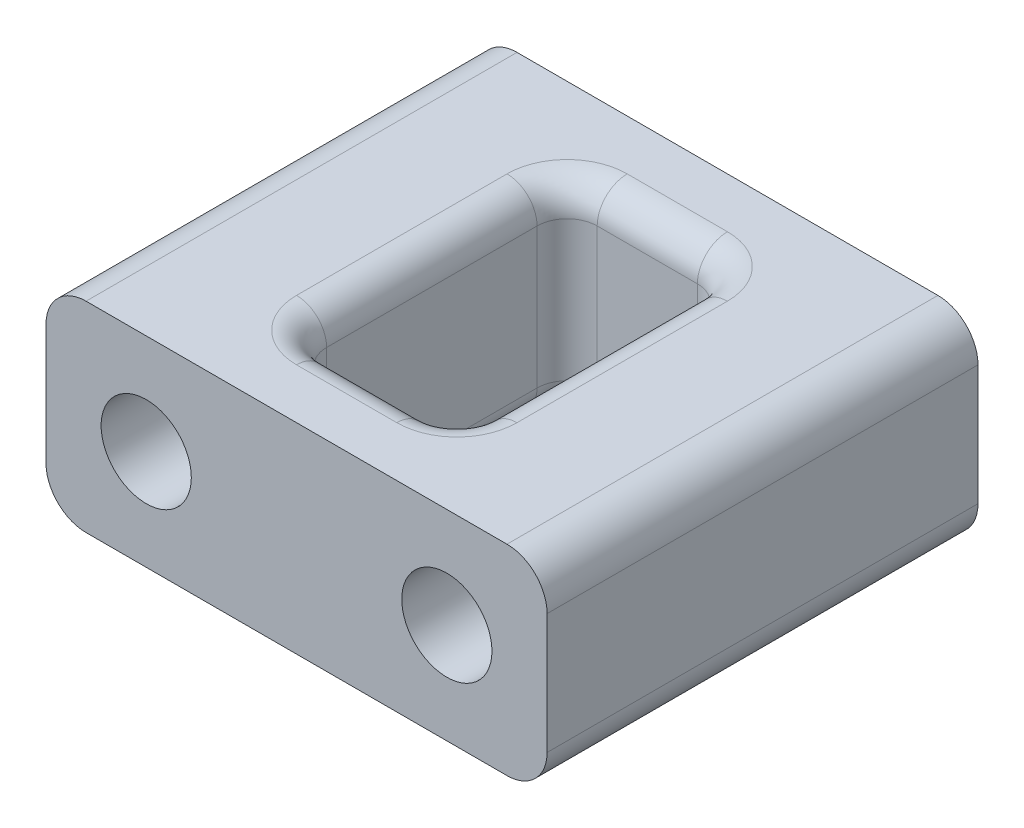
ISO-10303-21;
HEADER;
FILE_DESCRIPTION(('STEP AP214'),'2;1');
FILE_NAME('part.step','',(''),(''),'','','');
FILE_SCHEMA(('AUTOMOTIVE_DESIGN { 1 0 10303 214 1 1 1 1 }'));
ENDSEC;
DATA;
#1=APPLICATION_CONTEXT('core data for automotive mechanical design processes');
#2=APPLICATION_PROTOCOL_DEFINITION('international standard','automotive_design',2000,#1);
#3=PRODUCT_CONTEXT('',#1,'mechanical');
#4=PRODUCT('Part','Part','',(#3));
#5=PRODUCT_RELATED_PRODUCT_CATEGORY('part','',(#4));
#6=PRODUCT_DEFINITION_FORMATION('','',#4);
#7=PRODUCT_DEFINITION_CONTEXT('part definition',#1,'design');
#8=PRODUCT_DEFINITION('design','',#6,#7);
#9=PRODUCT_DEFINITION_SHAPE('','',#8);
#10=(LENGTH_UNIT() NAMED_UNIT(*) SI_UNIT(.MILLI.,.METRE.));
#11=(NAMED_UNIT(*) PLANE_ANGLE_UNIT() SI_UNIT($,.RADIAN.));
#12=(NAMED_UNIT(*) SI_UNIT($,.STERADIAN.) SOLID_ANGLE_UNIT());
#13=UNCERTAINTY_MEASURE_WITH_UNIT(LENGTH_MEASURE(1.E-05),#10,'distance_accuracy_value','');
#14=(GEOMETRIC_REPRESENTATION_CONTEXT(3) GLOBAL_UNCERTAINTY_ASSIGNED_CONTEXT((#13)) GLOBAL_UNIT_ASSIGNED_CONTEXT((#10,
#11,#12)) REPRESENTATION_CONTEXT('',''));
#15=CARTESIAN_POINT('',(0.,0.,0.));
#16=DIRECTION('',(0.,0.,1.));
#17=DIRECTION('',(1.,0.,0.));
#18=AXIS2_PLACEMENT_3D('',#15,#16,#17);
#19=CARTESIAN_POINT('',(0.,10.,21.5));
#20=DIRECTION('',(0.,-1.,0.));
#21=DIRECTION('',(0.,0.,-1.));
#22=AXIS2_PLACEMENT_3D('',#19,#20,#21);
#23=PLANE('',#22);
#24=DIRECTION('',(-1.,0.,0.));
#25=VECTOR('',#24,1.);
#26=CARTESIAN_POINT('',(0.,10.,0.));
#27=LINE('',#26,#25);
#28=CARTESIAN_POINT('',(23.,10.,0.));
#29=VERTEX_POINT('',#28);
#30=CARTESIAN_POINT('',(2.,10.,0.));
#31=VERTEX_POINT('',#30);
#32=EDGE_CURVE('E245',#29,#31,#27,.T.);
#33=ORIENTED_EDGE('',*,*,#32,.T.);
#34=DIRECTION('',(0.,0.,-1.));
#35=VECTOR('',#34,1.);
#36=CARTESIAN_POINT('',(2.,10.,21.5));
#37=LINE('',#36,#35);
#38=CARTESIAN_POINT('',(2.,10.,21.5));
#39=VERTEX_POINT('',#38);
#40=EDGE_CURVE('E285',#31,#39,#37,.F.);
#41=ORIENTED_EDGE('',*,*,#40,.T.);
#42=DIRECTION('',(-1.,0.,0.));
#43=VECTOR('',#42,1.);
#44=CARTESIAN_POINT('',(0.,10.,21.5));
#45=LINE('',#44,#43);
#46=CARTESIAN_POINT('',(23.,10.,21.5));
#47=VERTEX_POINT('',#46);
#48=EDGE_CURVE('E256',#47,#39,#45,.T.);
#49=ORIENTED_EDGE('',*,*,#48,.F.);
#50=DIRECTION('',(0.,0.,-1.));
#51=VECTOR('',#50,1.);
#52=CARTESIAN_POINT('',(23.,10.,21.5));
#53=LINE('',#52,#51);
#54=EDGE_CURVE('E281',#47,#29,#53,.T.);
#55=ORIENTED_EDGE('',*,*,#54,.T.);
#56=EDGE_LOOP('',(#33,#41,#49,#55));
#57=FACE_BOUND('',#56,.T.);
#58=CARTESIAN_POINT('',(10.,10.,16.));
#59=DIRECTION('',(0.,-1.,0.));
#60=DIRECTION('',(0.,0.,-1.));
#61=AXIS2_PLACEMENT_3D('',#58,#59,#60);
#62=CIRCLE('',#61,3.);
#63=CARTESIAN_POINT('',(7.,10.,16.));
#64=VERTEX_POINT('',#63);
#65=CARTESIAN_POINT('',(10.,10.,19.));
#66=VERTEX_POINT('',#65);
#67=EDGE_CURVE('E361',#64,#66,#62,.F.);
#68=ORIENTED_EDGE('',*,*,#67,.F.);
#69=DIRECTION('',(0.,0.,1.));
#70=VECTOR('',#69,1.);
#71=CARTESIAN_POINT('',(7.,10.,21.5));
#72=LINE('',#71,#70);
#73=CARTESIAN_POINT('',(7.,10.,5.5));
#74=VERTEX_POINT('',#73);
#75=EDGE_CURVE('E357',#64,#74,#72,.F.);
#76=ORIENTED_EDGE('',*,*,#75,.T.);
#77=CARTESIAN_POINT('',(10.,10.,5.5));
#78=DIRECTION('',(0.,-1.,0.));
#79=DIRECTION('',(0.,0.,-1.));
#80=AXIS2_PLACEMENT_3D('',#77,#78,#79);
#81=CIRCLE('',#80,3.);
#82=CARTESIAN_POINT('',(10.,10.,2.5));
#83=VERTEX_POINT('',#82);
#84=EDGE_CURVE('E354',#83,#74,#81,.F.);
#85=ORIENTED_EDGE('',*,*,#84,.F.);
#86=DIRECTION('',(-1.,0.,0.));
#87=VECTOR('',#86,1.);
#88=CARTESIAN_POINT('',(0.,10.,2.5));
#89=LINE('',#88,#87);
#90=CARTESIAN_POINT('',(15.,10.,2.5));
#91=VERTEX_POINT('',#90);
#92=EDGE_CURVE('E348',#83,#91,#89,.F.);
#93=ORIENTED_EDGE('',*,*,#92,.T.);
#94=CARTESIAN_POINT('',(15.,10.,5.5));
#95=DIRECTION('',(0.,-1.,0.));
#96=DIRECTION('',(0.,0.,-1.));
#97=AXIS2_PLACEMENT_3D('',#94,#95,#96);
#98=CIRCLE('',#97,3.);
#99=CARTESIAN_POINT('',(18.,10.,5.5));
#100=VERTEX_POINT('',#99);
#101=EDGE_CURVE('E344',#100,#91,#98,.F.);
#102=ORIENTED_EDGE('',*,*,#101,.F.);
#103=DIRECTION('',(0.,0.,-1.));
#104=VECTOR('',#103,1.);
#105=CARTESIAN_POINT('',(18.,10.,21.5));
#106=LINE('',#105,#104);
#107=CARTESIAN_POINT('',(18.,10.,16.));
#108=VERTEX_POINT('',#107);
#109=EDGE_CURVE('E341',#100,#108,#106,.F.);
#110=ORIENTED_EDGE('',*,*,#109,.T.);
#111=CARTESIAN_POINT('',(15.,10.,16.));
#112=DIRECTION('',(0.,-1.,0.));
#113=DIRECTION('',(0.,0.,-1.));
#114=AXIS2_PLACEMENT_3D('',#111,#112,#113);
#115=CIRCLE('',#114,3.);
#116=CARTESIAN_POINT('',(15.,10.,19.));
#117=VERTEX_POINT('',#116);
#118=EDGE_CURVE('E337',#117,#108,#115,.F.);
#119=ORIENTED_EDGE('',*,*,#118,.F.);
#120=DIRECTION('',(1.,0.,0.));
#121=VECTOR('',#120,1.);
#122=CARTESIAN_POINT('',(0.,10.,19.));
#123=LINE('',#122,#121);
#124=EDGE_CURVE('E351',#117,#66,#123,.F.);
#125=ORIENTED_EDGE('',*,*,#124,.T.);
#126=EDGE_LOOP('',(#68,#76,#85,#93,#102,#110,#119,#125));
#127=FACE_BOUND('',#126,.T.);
#128=ADVANCED_FACE('F46',(#57,#127),#23,.F.);
#129=CARTESIAN_POINT('',(0.,0.,21.5));
#130=DIRECTION('',(0.,1.,0.));
#131=DIRECTION('',(0.,0.,1.));
#132=AXIS2_PLACEMENT_3D('',#129,#130,#131);
#133=PLANE('',#132);
#134=DIRECTION('',(1.,0.,0.));
#135=VECTOR('',#134,1.);
#136=CARTESIAN_POINT('',(0.,0.,21.5));
#137=LINE('',#136,#135);
#138=CARTESIAN_POINT('',(2.,0.,21.5));
#139=VERTEX_POINT('',#138);
#140=CARTESIAN_POINT('',(23.,0.,21.5));
#141=VERTEX_POINT('',#140);
#142=EDGE_CURVE('E229',#139,#141,#137,.T.);
#143=ORIENTED_EDGE('',*,*,#142,.F.);
#144=DIRECTION('',(0.,0.,-1.));
#145=VECTOR('',#144,1.);
#146=CARTESIAN_POINT('',(2.,0.,21.5));
#147=LINE('',#146,#145);
#148=CARTESIAN_POINT('',(2.,0.,0.));
#149=VERTEX_POINT('',#148);
#150=EDGE_CURVE('E211',#139,#149,#147,.T.);
#151=ORIENTED_EDGE('',*,*,#150,.T.);
#152=DIRECTION('',(1.,0.,0.));
#153=VECTOR('',#152,1.);
#154=CARTESIAN_POINT('',(0.,0.,0.));
#155=LINE('',#154,#153);
#156=CARTESIAN_POINT('',(23.,0.,0.));
#157=VERTEX_POINT('',#156);
#158=EDGE_CURVE('E226',#149,#157,#155,.T.);
#159=ORIENTED_EDGE('',*,*,#158,.T.);
#160=DIRECTION('',(0.,0.,-1.));
#161=VECTOR('',#160,1.);
#162=CARTESIAN_POINT('',(23.,0.,21.5));
#163=LINE('',#162,#161);
#164=EDGE_CURVE('E232',#157,#141,#163,.F.);
#165=ORIENTED_EDGE('',*,*,#164,.T.);
#166=EDGE_LOOP('',(#143,#151,#159,#165));
#167=FACE_BOUND('',#166,.T.);
#168=CARTESIAN_POINT('',(10.,0.,5.5));
#169=DIRECTION('',(0.,1.,0.));
#170=DIRECTION('',(0.,0.,1.));
#171=AXIS2_PLACEMENT_3D('',#168,#169,#170);
#172=CIRCLE('',#171,3.);
#173=CARTESIAN_POINT('',(7.,0.,5.5));
#174=VERTEX_POINT('',#173);
#175=CARTESIAN_POINT('',(10.,0.,2.5));
#176=VERTEX_POINT('',#175);
#177=EDGE_CURVE('E320',#174,#176,#172,.F.);
#178=ORIENTED_EDGE('',*,*,#177,.F.);
#179=DIRECTION('',(0.,0.,1.));
#180=VECTOR('',#179,1.);
#181=CARTESIAN_POINT('',(7.,0.,21.5));
#182=LINE('',#181,#180);
#183=CARTESIAN_POINT('',(7.,0.,16.));
#184=VERTEX_POINT('',#183);
#185=EDGE_CURVE('E316',#174,#184,#182,.T.);
#186=ORIENTED_EDGE('',*,*,#185,.T.);
#187=CARTESIAN_POINT('',(10.,0.,16.));
#188=DIRECTION('',(0.,1.,0.));
#189=DIRECTION('',(0.,0.,1.));
#190=AXIS2_PLACEMENT_3D('',#187,#188,#189);
#191=CIRCLE('',#190,3.);
#192=CARTESIAN_POINT('',(10.,0.,19.));
#193=VERTEX_POINT('',#192);
#194=EDGE_CURVE('E312',#193,#184,#191,.F.);
#195=ORIENTED_EDGE('',*,*,#194,.F.);
#196=DIRECTION('',(1.,0.,0.));
#197=VECTOR('',#196,1.);
#198=CARTESIAN_POINT('',(0.,0.,19.));
#199=LINE('',#198,#197);
#200=CARTESIAN_POINT('',(15.,0.,19.));
#201=VERTEX_POINT('',#200);
#202=EDGE_CURVE('E309',#193,#201,#199,.T.);
#203=ORIENTED_EDGE('',*,*,#202,.T.);
#204=CARTESIAN_POINT('',(15.,0.,16.));
#205=DIRECTION('',(0.,1.,0.));
#206=DIRECTION('',(0.,0.,1.));
#207=AXIS2_PLACEMENT_3D('',#204,#205,#206);
#208=CIRCLE('',#207,3.);
#209=CARTESIAN_POINT('',(18.,0.,16.));
#210=VERTEX_POINT('',#209);
#211=EDGE_CURVE('E305',#210,#201,#208,.F.);
#212=ORIENTED_EDGE('',*,*,#211,.F.);
#213=DIRECTION('',(0.,0.,-1.));
#214=VECTOR('',#213,1.);
#215=CARTESIAN_POINT('',(18.,0.,21.5));
#216=LINE('',#215,#214);
#217=CARTESIAN_POINT('',(18.,0.,5.5));
#218=VERTEX_POINT('',#217);
#219=EDGE_CURVE('E299',#210,#218,#216,.T.);
#220=ORIENTED_EDGE('',*,*,#219,.T.);
#221=CARTESIAN_POINT('',(15.,0.,5.5));
#222=DIRECTION('',(0.,1.,0.));
#223=DIRECTION('',(0.,0.,1.));
#224=AXIS2_PLACEMENT_3D('',#221,#222,#223);
#225=CIRCLE('',#224,3.);
#226=CARTESIAN_POINT('',(15.,0.,2.5));
#227=VERTEX_POINT('',#226);
#228=EDGE_CURVE('E295',#227,#218,#225,.F.);
#229=ORIENTED_EDGE('',*,*,#228,.F.);
#230=DIRECTION('',(-1.,0.,0.));
#231=VECTOR('',#230,1.);
#232=CARTESIAN_POINT('',(0.,0.,2.5));
#233=LINE('',#232,#231);
#234=EDGE_CURVE('E302',#227,#176,#233,.T.);
#235=ORIENTED_EDGE('',*,*,#234,.T.);
#236=EDGE_LOOP('',(#178,#186,#195,#203,#212,#220,#229,#235));
#237=FACE_BOUND('',#236,.T.);
#238=ADVANCED_FACE('F224',(#167,#237),#133,.F.);
#239=CARTESIAN_POINT('',(0.,0.,21.5));
#240=DIRECTION('',(0.,0.,-1.));
#241=DIRECTION('',(-1.,0.,0.));
#242=AXIS2_PLACEMENT_3D('',#239,#240,#241);
#243=PLANE('',#242);
#244=DIRECTION('',(0.,-1.,0.));
#245=VECTOR('',#244,1.);
#246=CARTESIAN_POINT('',(0.,0.,21.5));
#247=LINE('',#246,#245);
#248=CARTESIAN_POINT('',(0.,8.,21.5));
#249=VERTEX_POINT('',#248);
#250=CARTESIAN_POINT('',(0.,2.,21.5));
#251=VERTEX_POINT('',#250);
#252=EDGE_CURVE('E254',#249,#251,#247,.T.);
#253=ORIENTED_EDGE('',*,*,#252,.T.);
#254=CARTESIAN_POINT('',(2.,2.,21.5));
#255=DIRECTION('',(0.,0.,-1.));
#256=DIRECTION('',(-1.,0.,0.));
#257=AXIS2_PLACEMENT_3D('',#254,#255,#256);
#258=CIRCLE('',#257,2.);
#259=EDGE_CURVE('E278',#251,#139,#258,.F.);
#260=ORIENTED_EDGE('',*,*,#259,.T.);
#261=ORIENTED_EDGE('',*,*,#142,.T.);
#262=CARTESIAN_POINT('',(23.,2.,21.5));
#263=DIRECTION('',(0.,0.,-1.));
#264=DIRECTION('',(-1.,0.,0.));
#265=AXIS2_PLACEMENT_3D('',#262,#263,#264);
#266=CIRCLE('',#265,2.);
#267=CARTESIAN_POINT('',(25.,2.,21.5));
#268=VERTEX_POINT('',#267);
#269=EDGE_CURVE('E272',#141,#268,#266,.F.);
#270=ORIENTED_EDGE('',*,*,#269,.T.);
#271=DIRECTION('',(0.,1.,0.));
#272=VECTOR('',#271,1.);
#273=CARTESIAN_POINT('',(25.,0.,21.5));
#274=LINE('',#273,#272);
#275=CARTESIAN_POINT('',(25.,8.,21.5));
#276=VERTEX_POINT('',#275);
#277=EDGE_CURVE('E514',#268,#276,#274,.T.);
#278=ORIENTED_EDGE('',*,*,#277,.T.);
#279=CARTESIAN_POINT('',(23.,8.,21.5));
#280=DIRECTION('',(0.,0.,-1.));
#281=DIRECTION('',(-1.,0.,0.));
#282=AXIS2_PLACEMENT_3D('',#279,#280,#281);
#283=CIRCLE('',#282,2.);
#284=EDGE_CURVE('E269',#276,#47,#283,.F.);
#285=ORIENTED_EDGE('',*,*,#284,.T.);
#286=ORIENTED_EDGE('',*,*,#48,.T.);
#287=CARTESIAN_POINT('',(2.,8.,21.5));
#288=DIRECTION('',(0.,0.,-1.));
#289=DIRECTION('',(-1.,0.,0.));
#290=AXIS2_PLACEMENT_3D('',#287,#288,#289);
#291=CIRCLE('',#290,2.);
#292=EDGE_CURVE('E275',#39,#249,#291,.F.);
#293=ORIENTED_EDGE('',*,*,#292,.T.);
#294=EDGE_LOOP('',(#253,#260,#261,#270,#278,#285,#286,#293));
#295=FACE_BOUND('',#294,.T.);
#296=CARTESIAN_POINT('',(5.,5.,21.5));
#297=DIRECTION('',(0.,0.,1.));
#298=DIRECTION('',(1.,0.,0.));
#299=AXIS2_PLACEMENT_3D('',#296,#297,#298);
#300=CIRCLE('',#299,2.25);
#301=CARTESIAN_POINT('',(7.25,5.,21.5));
#302=VERTEX_POINT('',#301);
#303=EDGE_CURVE('E247',#302,#302,#300,.T.);
#304=ORIENTED_EDGE('',*,*,#303,.F.);
#305=EDGE_LOOP('',(#304));
#306=FACE_BOUND('',#305,.T.);
#307=CARTESIAN_POINT('',(20.,5.,21.5));
#308=DIRECTION('',(0.,0.,1.));
#309=DIRECTION('',(1.,0.,0.));
#310=AXIS2_PLACEMENT_3D('',#307,#308,#309);
#311=CIRCLE('',#310,2.25);
#312=CARTESIAN_POINT('',(22.25,5.,21.5));
#313=VERTEX_POINT('',#312);
#314=EDGE_CURVE('E495',#313,#313,#311,.T.);
#315=ORIENTED_EDGE('',*,*,#314,.F.);
#316=EDGE_LOOP('',(#315));
#317=FACE_BOUND('',#316,.T.);
#318=ADVANCED_FACE('F522',(#295,#306,#317),#243,.F.);
#319=CARTESIAN_POINT('',(0.,0.,0.));
#320=DIRECTION('',(0.,0.,-1.));
#321=DIRECTION('',(-1.,0.,0.));
#322=AXIS2_PLACEMENT_3D('',#319,#320,#321);
#323=PLANE('',#322);
#324=CARTESIAN_POINT('',(5.,5.,0.));
#325=DIRECTION('',(0.,0.,1.));
#326=DIRECTION('',(1.,0.,0.));
#327=AXIS2_PLACEMENT_3D('',#324,#325,#326);
#328=CIRCLE('',#327,2.25);
#329=CARTESIAN_POINT('',(7.25,5.,0.));
#330=VERTEX_POINT('',#329);
#331=EDGE_CURVE('E500',#330,#330,#328,.T.);
#332=ORIENTED_EDGE('',*,*,#331,.T.);
#333=EDGE_LOOP('',(#332));
#334=FACE_BOUND('',#333,.T.);
#335=ORIENTED_EDGE('',*,*,#158,.F.);
#336=CARTESIAN_POINT('',(2.,2.,0.));
#337=DIRECTION('',(0.,0.,-1.));
#338=DIRECTION('',(-1.,0.,0.));
#339=AXIS2_PLACEMENT_3D('',#336,#337,#338);
#340=CIRCLE('',#339,2.);
#341=CARTESIAN_POINT('',(0.,2.,0.));
#342=VERTEX_POINT('',#341);
#343=EDGE_CURVE('E207',#149,#342,#340,.T.);
#344=ORIENTED_EDGE('',*,*,#343,.T.);
#345=DIRECTION('',(0.,-1.,0.));
#346=VECTOR('',#345,1.);
#347=CARTESIAN_POINT('',(0.,0.,0.));
#348=LINE('',#347,#346);
#349=CARTESIAN_POINT('',(0.,8.,0.));
#350=VERTEX_POINT('',#349);
#351=EDGE_CURVE('E240',#350,#342,#348,.T.);
#352=ORIENTED_EDGE('',*,*,#351,.F.);
#353=CARTESIAN_POINT('',(2.,8.,0.));
#354=DIRECTION('',(0.,0.,-1.));
#355=DIRECTION('',(-1.,0.,0.));
#356=AXIS2_PLACEMENT_3D('',#353,#354,#355);
#357=CIRCLE('',#356,2.);
#358=EDGE_CURVE('E219',#350,#31,#357,.T.);
#359=ORIENTED_EDGE('',*,*,#358,.T.);
#360=ORIENTED_EDGE('',*,*,#32,.F.);
#361=CARTESIAN_POINT('',(23.,8.,0.));
#362=DIRECTION('',(0.,0.,-1.));
#363=DIRECTION('',(-1.,0.,0.));
#364=AXIS2_PLACEMENT_3D('',#361,#362,#363);
#365=CIRCLE('',#364,2.);
#366=CARTESIAN_POINT('',(25.,8.,0.));
#367=VERTEX_POINT('',#366);
#368=EDGE_CURVE('E231',#29,#367,#365,.T.);
#369=ORIENTED_EDGE('',*,*,#368,.T.);
#370=DIRECTION('',(0.,1.,0.));
#371=VECTOR('',#370,1.);
#372=CARTESIAN_POINT('',(25.,0.,0.));
#373=LINE('',#372,#371);
#374=CARTESIAN_POINT('',(25.,2.,0.));
#375=VERTEX_POINT('',#374);
#376=EDGE_CURVE('E239',#375,#367,#373,.T.);
#377=ORIENTED_EDGE('',*,*,#376,.F.);
#378=CARTESIAN_POINT('',(23.,2.,0.));
#379=DIRECTION('',(0.,0.,-1.));
#380=DIRECTION('',(-1.,0.,0.));
#381=AXIS2_PLACEMENT_3D('',#378,#379,#380);
#382=CIRCLE('',#381,2.);
#383=EDGE_CURVE('E237',#375,#157,#382,.T.);
#384=ORIENTED_EDGE('',*,*,#383,.T.);
#385=EDGE_LOOP('',(#335,#344,#352,#359,#360,#369,#377,#384));
#386=FACE_BOUND('',#385,.T.);
#387=CARTESIAN_POINT('',(20.,5.,0.));
#388=DIRECTION('',(0.,0.,1.));
#389=DIRECTION('',(1.,0.,0.));
#390=AXIS2_PLACEMENT_3D('',#387,#388,#389);
#391=CIRCLE('',#390,2.25);
#392=CARTESIAN_POINT('',(22.25,5.,0.));
#393=VERTEX_POINT('',#392);
#394=EDGE_CURVE('E489',#393,#393,#391,.T.);
#395=ORIENTED_EDGE('',*,*,#394,.T.);
#396=EDGE_LOOP('',(#395));
#397=FACE_BOUND('',#396,.T.);
#398=ADVANCED_FACE('F234',(#334,#386,#397),#323,.T.);
#399=CARTESIAN_POINT('',(0.,0.,21.5));
#400=DIRECTION('',(1.,0.,0.));
#401=DIRECTION('',(0.,0.,-1.));
#402=AXIS2_PLACEMENT_3D('',#399,#400,#401);
#403=PLANE('',#402);
#404=ORIENTED_EDGE('',*,*,#351,.T.);
#405=DIRECTION('',(0.,0.,-1.));
#406=VECTOR('',#405,1.);
#407=CARTESIAN_POINT('',(0.,2.,21.5));
#408=LINE('',#407,#406);
#409=EDGE_CURVE('E212',#342,#251,#408,.F.);
#410=ORIENTED_EDGE('',*,*,#409,.T.);
#411=ORIENTED_EDGE('',*,*,#252,.F.);
#412=DIRECTION('',(0.,0.,-1.));
#413=VECTOR('',#412,1.);
#414=CARTESIAN_POINT('',(0.,8.,21.5));
#415=LINE('',#414,#413);
#416=EDGE_CURVE('E218',#249,#350,#415,.T.);
#417=ORIENTED_EDGE('',*,*,#416,.T.);
#418=EDGE_LOOP('',(#404,#410,#411,#417));
#419=FACE_BOUND('',#418,.T.);
#420=ADVANCED_FACE('F533',(#419),#403,.F.);
#421=CARTESIAN_POINT('',(25.,0.,21.5));
#422=DIRECTION('',(-1.,0.,0.));
#423=DIRECTION('',(0.,0.,1.));
#424=AXIS2_PLACEMENT_3D('',#421,#422,#423);
#425=PLANE('',#424);
#426=ORIENTED_EDGE('',*,*,#277,.F.);
#427=DIRECTION('',(0.,0.,-1.));
#428=VECTOR('',#427,1.);
#429=CARTESIAN_POINT('',(25.,2.,21.5));
#430=LINE('',#429,#428);
#431=EDGE_CURVE('E291',#268,#375,#430,.T.);
#432=ORIENTED_EDGE('',*,*,#431,.T.);
#433=ORIENTED_EDGE('',*,*,#376,.T.);
#434=DIRECTION('',(0.,0.,-1.));
#435=VECTOR('',#434,1.);
#436=CARTESIAN_POINT('',(25.,8.,21.5));
#437=LINE('',#436,#435);
#438=EDGE_CURVE('E288',#367,#276,#437,.F.);
#439=ORIENTED_EDGE('',*,*,#438,.T.);
#440=EDGE_LOOP('',(#426,#432,#433,#439));
#441=FACE_BOUND('',#440,.T.);
#442=ADVANCED_FACE('F541',(#441),#425,.F.);
#443=CARTESIAN_POINT('',(5.,5.,21.5));
#444=DIRECTION('',(0.,0.,-1.));
#445=DIRECTION('',(-1.,0.,0.));
#446=AXIS2_PLACEMENT_3D('',#443,#444,#445);
#447=CYLINDRICAL_SURFACE('',#446,2.25);
#448=ORIENTED_EDGE('',*,*,#303,.T.);
#449=EDGE_LOOP('',(#448));
#450=FACE_BOUND('',#449,.T.);
#451=ORIENTED_EDGE('',*,*,#331,.F.);
#452=EDGE_LOOP('',(#451));
#453=FACE_BOUND('',#452,.T.);
#454=ADVANCED_FACE('F565',(#450,#453),#447,.F.);
#455=CARTESIAN_POINT('',(20.,5.,21.5));
#456=DIRECTION('',(0.,0.,-1.));
#457=DIRECTION('',(-1.,0.,0.));
#458=AXIS2_PLACEMENT_3D('',#455,#456,#457);
#459=CYLINDRICAL_SURFACE('',#458,2.25);
#460=ORIENTED_EDGE('',*,*,#314,.T.);
#461=EDGE_LOOP('',(#460));
#462=FACE_BOUND('',#461,.T.);
#463=ORIENTED_EDGE('',*,*,#394,.F.);
#464=EDGE_LOOP('',(#463));
#465=FACE_BOUND('',#464,.T.);
#466=ADVANCED_FACE('F570',(#462,#465),#459,.F.);
#467=CARTESIAN_POINT('',(2.,2.,21.5));
#468=DIRECTION('',(0.,0.,-1.));
#469=DIRECTION('',(-1.,0.,0.));
#470=AXIS2_PLACEMENT_3D('',#467,#468,#469);
#471=CYLINDRICAL_SURFACE('',#470,2.);
#472=ORIENTED_EDGE('',*,*,#259,.F.);
#473=ORIENTED_EDGE('',*,*,#409,.F.);
#474=ORIENTED_EDGE('',*,*,#343,.F.);
#475=ORIENTED_EDGE('',*,*,#150,.F.);
#476=EDGE_LOOP('',(#472,#473,#474,#475));
#477=FACE_BOUND('',#476,.T.);
#478=ADVANCED_FACE('F210',(#477),#471,.T.);
#479=CARTESIAN_POINT('',(2.,8.,21.5));
#480=DIRECTION('',(0.,0.,-1.));
#481=DIRECTION('',(-1.,0.,0.));
#482=AXIS2_PLACEMENT_3D('',#479,#480,#481);
#483=CYLINDRICAL_SURFACE('',#482,2.);
#484=ORIENTED_EDGE('',*,*,#292,.F.);
#485=ORIENTED_EDGE('',*,*,#40,.F.);
#486=ORIENTED_EDGE('',*,*,#358,.F.);
#487=ORIENTED_EDGE('',*,*,#416,.F.);
#488=EDGE_LOOP('',(#484,#485,#486,#487));
#489=FACE_BOUND('',#488,.T.);
#490=ADVANCED_FACE('F531',(#489),#483,.T.);
#491=CARTESIAN_POINT('',(23.,2.,21.5));
#492=DIRECTION('',(0.,0.,-1.));
#493=DIRECTION('',(-1.,0.,0.));
#494=AXIS2_PLACEMENT_3D('',#491,#492,#493);
#495=CYLINDRICAL_SURFACE('',#494,2.);
#496=ORIENTED_EDGE('',*,*,#269,.F.);
#497=ORIENTED_EDGE('',*,*,#164,.F.);
#498=ORIENTED_EDGE('',*,*,#383,.F.);
#499=ORIENTED_EDGE('',*,*,#431,.F.);
#500=EDGE_LOOP('',(#496,#497,#498,#499));
#501=FACE_BOUND('',#500,.T.);
#502=ADVANCED_FACE('F545',(#501),#495,.T.);
#503=CARTESIAN_POINT('',(23.,8.,21.5));
#504=DIRECTION('',(0.,0.,-1.));
#505=DIRECTION('',(-1.,0.,0.));
#506=AXIS2_PLACEMENT_3D('',#503,#504,#505);
#507=CYLINDRICAL_SURFACE('',#506,2.);
#508=ORIENTED_EDGE('',*,*,#284,.F.);
#509=ORIENTED_EDGE('',*,*,#438,.F.);
#510=ORIENTED_EDGE('',*,*,#368,.F.);
#511=ORIENTED_EDGE('',*,*,#54,.F.);
#512=EDGE_LOOP('',(#508,#509,#510,#511));
#513=FACE_BOUND('',#512,.T.);
#514=ADVANCED_FACE('F537',(#513),#507,.T.);
#515=CARTESIAN_POINT('',(8.5,0.,4.));
#516=DIRECTION('',(-1.,0.,0.));
#517=DIRECTION('',(0.,0.,1.));
#518=AXIS2_PLACEMENT_3D('',#515,#516,#517);
#519=PLANE('',#518);
#520=DIRECTION('',(0.,0.,1.));
#521=VECTOR('',#520,1.);
#522=CARTESIAN_POINT('',(8.5,1.5,4.));
#523=LINE('',#522,#521);
#524=CARTESIAN_POINT('',(8.5,1.5,16.));
#525=VERTEX_POINT('',#524);
#526=CARTESIAN_POINT('',(8.5,1.5,5.5));
#527=VERTEX_POINT('',#526);
#528=EDGE_CURVE('E330',#525,#527,#523,.F.);
#529=ORIENTED_EDGE('',*,*,#528,.T.);
#530=DIRECTION('',(0.,1.,0.));
#531=VECTOR('',#530,1.);
#532=CARTESIAN_POINT('',(8.5,10.,5.5));
#533=LINE('',#532,#531);
#534=CARTESIAN_POINT('',(8.5,8.5,5.5));
#535=VERTEX_POINT('',#534);
#536=EDGE_CURVE('E334',#527,#535,#533,.T.);
#537=ORIENTED_EDGE('',*,*,#536,.T.);
#538=DIRECTION('',(0.,0.,1.));
#539=VECTOR('',#538,1.);
#540=CARTESIAN_POINT('',(8.5,8.5,4.));
#541=LINE('',#540,#539);
#542=CARTESIAN_POINT('',(8.5,8.5,16.));
#543=VERTEX_POINT('',#542);
#544=EDGE_CURVE('E327',#535,#543,#541,.T.);
#545=ORIENTED_EDGE('',*,*,#544,.T.);
#546=DIRECTION('',(0.,1.,0.));
#547=VECTOR('',#546,1.);
#548=CARTESIAN_POINT('',(8.5,0.,16.));
#549=LINE('',#548,#547);
#550=EDGE_CURVE('E324',#543,#525,#549,.F.);
#551=ORIENTED_EDGE('',*,*,#550,.T.);
#552=EDGE_LOOP('',(#529,#537,#545,#551));
#553=FACE_BOUND('',#552,.T.);
#554=ADVANCED_FACE('F552',(#553),#519,.F.);
#555=CARTESIAN_POINT('',(8.5,0.,4.));
#556=DIRECTION('',(0.,0.,-1.));
#557=DIRECTION('',(-1.,0.,0.));
#558=AXIS2_PLACEMENT_3D('',#555,#556,#557);
#559=PLANE('',#558);
#560=DIRECTION('',(-1.,0.,0.));
#561=VECTOR('',#560,1.);
#562=CARTESIAN_POINT('',(8.5,1.5,4.));
#563=LINE('',#562,#561);
#564=CARTESIAN_POINT('',(10.,1.5,4.));
#565=VERTEX_POINT('',#564);
#566=CARTESIAN_POINT('',(15.,1.5,4.));
#567=VERTEX_POINT('',#566);
#568=EDGE_CURVE('E384',#565,#567,#563,.F.);
#569=ORIENTED_EDGE('',*,*,#568,.T.);
#570=DIRECTION('',(0.,1.,0.));
#571=VECTOR('',#570,1.);
#572=CARTESIAN_POINT('',(15.,10.,4.));
#573=LINE('',#572,#571);
#574=CARTESIAN_POINT('',(15.,8.5,4.));
#575=VERTEX_POINT('',#574);
#576=EDGE_CURVE('E388',#567,#575,#573,.T.);
#577=ORIENTED_EDGE('',*,*,#576,.T.);
#578=DIRECTION('',(-1.,0.,0.));
#579=VECTOR('',#578,1.);
#580=CARTESIAN_POINT('',(8.5,8.5,4.));
#581=LINE('',#580,#579);
#582=CARTESIAN_POINT('',(10.,8.5,4.));
#583=VERTEX_POINT('',#582);
#584=EDGE_CURVE('E381',#575,#583,#581,.T.);
#585=ORIENTED_EDGE('',*,*,#584,.T.);
#586=DIRECTION('',(0.,1.,0.));
#587=VECTOR('',#586,1.);
#588=CARTESIAN_POINT('',(10.,0.,4.));
#589=LINE('',#588,#587);
#590=EDGE_CURVE('E378',#583,#565,#589,.F.);
#591=ORIENTED_EDGE('',*,*,#590,.T.);
#592=EDGE_LOOP('',(#569,#577,#585,#591));
#593=FACE_BOUND('',#592,.T.);
#594=ADVANCED_FACE('F643',(#593),#559,.F.);
#595=CARTESIAN_POINT('',(16.5,0.,4.));
#596=DIRECTION('',(1.,0.,0.));
#597=DIRECTION('',(0.,0.,-1.));
#598=AXIS2_PLACEMENT_3D('',#595,#596,#597);
#599=PLANE('',#598);
#600=DIRECTION('',(0.,0.,-1.));
#601=VECTOR('',#600,1.);
#602=CARTESIAN_POINT('',(16.5,1.5,4.));
#603=LINE('',#602,#601);
#604=CARTESIAN_POINT('',(16.5,1.5,5.5));
#605=VERTEX_POINT('',#604);
#606=CARTESIAN_POINT('',(16.5,1.5,16.));
#607=VERTEX_POINT('',#606);
#608=EDGE_CURVE('E56',#605,#607,#603,.F.);
#609=ORIENTED_EDGE('',*,*,#608,.T.);
#610=DIRECTION('',(0.,1.,0.));
#611=VECTOR('',#610,1.);
#612=CARTESIAN_POINT('',(16.5,10.,16.));
#613=LINE('',#612,#611);
#614=CARTESIAN_POINT('',(16.5,8.5,16.));
#615=VERTEX_POINT('',#614);
#616=EDGE_CURVE('E11',#607,#615,#613,.T.);
#617=ORIENTED_EDGE('',*,*,#616,.T.);
#618=DIRECTION('',(0.,0.,-1.));
#619=VECTOR('',#618,1.);
#620=CARTESIAN_POINT('',(16.5,8.5,4.));
#621=LINE('',#620,#619);
#622=CARTESIAN_POINT('',(16.5,8.5,5.5));
#623=VERTEX_POINT('',#622);
#624=EDGE_CURVE('E391',#615,#623,#621,.T.);
#625=ORIENTED_EDGE('',*,*,#624,.T.);
#626=DIRECTION('',(0.,1.,0.));
#627=VECTOR('',#626,1.);
#628=CARTESIAN_POINT('',(16.5,0.,5.5));
#629=LINE('',#628,#627);
#630=EDGE_CURVE('E67',#623,#605,#629,.F.);
#631=ORIENTED_EDGE('',*,*,#630,.T.);
#632=EDGE_LOOP('',(#609,#617,#625,#631));
#633=FACE_BOUND('',#632,.T.);
#634=ADVANCED_FACE('F652',(#633),#599,.F.);
#635=CARTESIAN_POINT('',(8.5,0.,17.5));
#636=DIRECTION('',(0.,0.,1.));
#637=DIRECTION('',(1.,0.,0.));
#638=AXIS2_PLACEMENT_3D('',#635,#636,#637);
#639=PLANE('',#638);
#640=DIRECTION('',(1.,0.,0.));
#641=VECTOR('',#640,1.);
#642=CARTESIAN_POINT('',(8.5,8.5,17.5));
#643=LINE('',#642,#641);
#644=CARTESIAN_POINT('',(10.,8.5,17.5));
#645=VERTEX_POINT('',#644);
#646=CARTESIAN_POINT('',(15.,8.5,17.5));
#647=VERTEX_POINT('',#646);
#648=EDGE_CURVE('E368',#645,#647,#643,.T.);
#649=ORIENTED_EDGE('',*,*,#648,.T.);
#650=DIRECTION('',(0.,1.,0.));
#651=VECTOR('',#650,1.);
#652=CARTESIAN_POINT('',(15.,0.,17.5));
#653=LINE('',#652,#651);
#654=CARTESIAN_POINT('',(15.,1.5,17.5));
#655=VERTEX_POINT('',#654);
#656=EDGE_CURVE('E375',#647,#655,#653,.F.);
#657=ORIENTED_EDGE('',*,*,#656,.T.);
#658=DIRECTION('',(1.,0.,0.));
#659=VECTOR('',#658,1.);
#660=CARTESIAN_POINT('',(8.5,1.5,17.5));
#661=LINE('',#660,#659);
#662=CARTESIAN_POINT('',(10.,1.5,17.5));
#663=VERTEX_POINT('',#662);
#664=EDGE_CURVE('E371',#655,#663,#661,.F.);
#665=ORIENTED_EDGE('',*,*,#664,.T.);
#666=DIRECTION('',(0.,1.,0.));
#667=VECTOR('',#666,1.);
#668=CARTESIAN_POINT('',(10.,10.,17.5));
#669=LINE('',#668,#667);
#670=EDGE_CURVE('E365',#663,#645,#669,.T.);
#671=ORIENTED_EDGE('',*,*,#670,.T.);
#672=EDGE_LOOP('',(#649,#657,#665,#671));
#673=FACE_BOUND('',#672,.T.);
#674=ADVANCED_FACE('F662',(#673),#639,.F.);
#675=CARTESIAN_POINT('',(18.,8.5,4.));
#676=DIRECTION('',(0.,0.,-1.));
#677=DIRECTION('',(-1.,0.,0.));
#678=AXIS2_PLACEMENT_3D('',#675,#676,#677);
#679=CYLINDRICAL_SURFACE('',#678,1.5);
#680=CARTESIAN_POINT('',(18.,8.5,16.));
#681=DIRECTION('',(0.,0.,1.));
#682=DIRECTION('',(1.,0.,0.));
#683=AXIS2_PLACEMENT_3D('',#680,#681,#682);
#684=CIRCLE('',#683,1.5);
#685=EDGE_CURVE('E480',#108,#615,#684,.T.);
#686=ORIENTED_EDGE('',*,*,#685,.F.);
#687=ORIENTED_EDGE('',*,*,#109,.F.);
#688=CARTESIAN_POINT('',(18.,8.5,5.5));
#689=DIRECTION('',(0.,0.,-1.));
#690=DIRECTION('',(-1.,0.,0.));
#691=AXIS2_PLACEMENT_3D('',#688,#689,#690);
#692=CIRCLE('',#691,1.5);
#693=EDGE_CURVE('E50',#623,#100,#692,.T.);
#694=ORIENTED_EDGE('',*,*,#693,.F.);
#695=ORIENTED_EDGE('',*,*,#624,.F.);
#696=EDGE_LOOP('',(#686,#687,#694,#695));
#697=FACE_BOUND('',#696,.T.);
#698=ADVANCED_FACE('F48',(#697),#679,.T.);
#699=CARTESIAN_POINT('',(15.,8.5,5.5));
#700=DIRECTION('',(0.,-1.,0.));
#701=DIRECTION('',(0.,0.,-1.));
#702=AXIS2_PLACEMENT_3D('',#699,#700,#701);
#703=TOROIDAL_SURFACE('',#702,3.,1.5);
#704=ORIENTED_EDGE('',*,*,#693,.T.);
#705=ORIENTED_EDGE('',*,*,#101,.T.);
#706=CARTESIAN_POINT('',(15.,8.5,2.5));
#707=DIRECTION('',(1.,0.,0.));
#708=DIRECTION('',(0.,0.,-1.));
#709=AXIS2_PLACEMENT_3D('',#706,#707,#708);
#710=CIRCLE('',#709,1.5);
#711=EDGE_CURVE('E477',#575,#91,#710,.F.);
#712=ORIENTED_EDGE('',*,*,#711,.F.);
#713=CARTESIAN_POINT('',(15.,8.5,5.5));
#714=DIRECTION('',(0.,-1.,0.));
#715=DIRECTION('',(0.,0.,-1.));
#716=AXIS2_PLACEMENT_3D('',#713,#714,#715);
#717=CIRCLE('',#716,1.5);
#718=EDGE_CURVE('E473',#623,#575,#717,.F.);
#719=ORIENTED_EDGE('',*,*,#718,.F.);
#720=EDGE_LOOP('',(#704,#705,#712,#719));
#721=FACE_BOUND('',#720,.T.);
#722=ADVANCED_FACE('F688',(#721),#703,.T.);
#723=CARTESIAN_POINT('',(15.,8.5,16.));
#724=DIRECTION('',(0.,-1.,0.));
#725=DIRECTION('',(0.,0.,-1.));
#726=AXIS2_PLACEMENT_3D('',#723,#724,#725);
#727=TOROIDAL_SURFACE('',#726,3.,1.5);
#728=ORIENTED_EDGE('',*,*,#118,.T.);
#729=ORIENTED_EDGE('',*,*,#685,.T.);
#730=CARTESIAN_POINT('',(15.,8.5,16.));
#731=DIRECTION('',(0.,-1.,0.));
#732=DIRECTION('',(0.,0.,-1.));
#733=AXIS2_PLACEMENT_3D('',#730,#731,#732);
#734=CIRCLE('',#733,1.5);
#735=EDGE_CURVE('E470',#647,#615,#734,.F.);
#736=ORIENTED_EDGE('',*,*,#735,.F.);
#737=CARTESIAN_POINT('',(15.,8.5,19.));
#738=DIRECTION('',(1.,0.,0.));
#739=DIRECTION('',(0.,0.,-1.));
#740=AXIS2_PLACEMENT_3D('',#737,#738,#739);
#741=CIRCLE('',#740,1.5);
#742=EDGE_CURVE('E466',#117,#647,#741,.F.);
#743=ORIENTED_EDGE('',*,*,#742,.F.);
#744=EDGE_LOOP('',(#728,#729,#736,#743));
#745=FACE_BOUND('',#744,.T.);
#746=ADVANCED_FACE('F697',(#745),#727,.T.);
#747=CARTESIAN_POINT('',(8.5,8.5,2.5));
#748=DIRECTION('',(-1.,0.,0.));
#749=DIRECTION('',(0.,0.,1.));
#750=AXIS2_PLACEMENT_3D('',#747,#748,#749);
#751=CYLINDRICAL_SURFACE('',#750,1.5);
#752=ORIENTED_EDGE('',*,*,#711,.T.);
#753=ORIENTED_EDGE('',*,*,#92,.F.);
#754=CARTESIAN_POINT('',(10.,8.5,2.5));
#755=DIRECTION('',(-1.,0.,0.));
#756=DIRECTION('',(0.,0.,1.));
#757=AXIS2_PLACEMENT_3D('',#754,#755,#756);
#758=CIRCLE('',#757,1.5);
#759=EDGE_CURVE('E458',#583,#83,#758,.T.);
#760=ORIENTED_EDGE('',*,*,#759,.F.);
#761=ORIENTED_EDGE('',*,*,#584,.F.);
#762=EDGE_LOOP('',(#752,#753,#760,#761));
#763=FACE_BOUND('',#762,.T.);
#764=ADVANCED_FACE('F705',(#763),#751,.T.);
#765=CARTESIAN_POINT('',(15.,0.,5.5));
#766=DIRECTION('',(0.,-1.,0.));
#767=DIRECTION('',(0.,0.,-1.));
#768=AXIS2_PLACEMENT_3D('',#765,#766,#767);
#769=CYLINDRICAL_SURFACE('',#768,1.5);
#770=ORIENTED_EDGE('',*,*,#718,.T.);
#771=ORIENTED_EDGE('',*,*,#576,.F.);
#772=CARTESIAN_POINT('',(15.,1.5,5.5));
#773=DIRECTION('',(0.,1.,0.));
#774=DIRECTION('',(0.,0.,1.));
#775=AXIS2_PLACEMENT_3D('',#772,#773,#774);
#776=CIRCLE('',#775,1.5);
#777=EDGE_CURVE('E454',#605,#567,#776,.T.);
#778=ORIENTED_EDGE('',*,*,#777,.F.);
#779=ORIENTED_EDGE('',*,*,#630,.F.);
#780=EDGE_LOOP('',(#770,#771,#778,#779));
#781=FACE_BOUND('',#780,.T.);
#782=ADVANCED_FACE('F714',(#781),#769,.F.);
#783=CARTESIAN_POINT('',(18.,1.5,21.5));
#784=DIRECTION('',(0.,0.,-1.));
#785=DIRECTION('',(-1.,0.,0.));
#786=AXIS2_PLACEMENT_3D('',#783,#784,#785);
#787=CYLINDRICAL_SURFACE('',#786,1.5);
#788=CARTESIAN_POINT('',(18.,1.5,16.));
#789=DIRECTION('',(0.,0.,1.));
#790=DIRECTION('',(1.,0.,0.));
#791=AXIS2_PLACEMENT_3D('',#788,#789,#790);
#792=CIRCLE('',#791,1.5);
#793=EDGE_CURVE('E446',#607,#210,#792,.T.);
#794=ORIENTED_EDGE('',*,*,#793,.F.);
#795=ORIENTED_EDGE('',*,*,#608,.F.);
#796=CARTESIAN_POINT('',(18.,1.5,5.5));
#797=DIRECTION('',(0.,0.,-1.));
#798=DIRECTION('',(-1.,0.,0.));
#799=AXIS2_PLACEMENT_3D('',#796,#797,#798);
#800=CIRCLE('',#799,1.5);
#801=EDGE_CURVE('E450',#218,#605,#800,.T.);
#802=ORIENTED_EDGE('',*,*,#801,.F.);
#803=ORIENTED_EDGE('',*,*,#219,.F.);
#804=EDGE_LOOP('',(#794,#795,#802,#803));
#805=FACE_BOUND('',#804,.T.);
#806=ADVANCED_FACE('F724',(#805),#787,.T.);
#807=CARTESIAN_POINT('',(15.,0.,16.));
#808=DIRECTION('',(0.,-1.,0.));
#809=DIRECTION('',(0.,0.,-1.));
#810=AXIS2_PLACEMENT_3D('',#807,#808,#809);
#811=CYLINDRICAL_SURFACE('',#810,1.5);
#812=ORIENTED_EDGE('',*,*,#735,.T.);
#813=ORIENTED_EDGE('',*,*,#616,.F.);
#814=CARTESIAN_POINT('',(15.,1.5,16.));
#815=DIRECTION('',(0.,1.,0.));
#816=DIRECTION('',(0.,0.,1.));
#817=AXIS2_PLACEMENT_3D('',#814,#815,#816);
#818=CIRCLE('',#817,1.5);
#819=EDGE_CURVE('E442',#655,#607,#818,.T.);
#820=ORIENTED_EDGE('',*,*,#819,.F.);
#821=ORIENTED_EDGE('',*,*,#656,.F.);
#822=EDGE_LOOP('',(#812,#813,#820,#821));
#823=FACE_BOUND('',#822,.T.);
#824=ADVANCED_FACE('F734',(#823),#811,.F.);
#825=CARTESIAN_POINT('',(8.5,8.5,19.));
#826=DIRECTION('',(1.,0.,0.));
#827=DIRECTION('',(0.,0.,-1.));
#828=AXIS2_PLACEMENT_3D('',#825,#826,#827);
#829=CYLINDRICAL_SURFACE('',#828,1.5);
#830=ORIENTED_EDGE('',*,*,#742,.T.);
#831=ORIENTED_EDGE('',*,*,#648,.F.);
#832=CARTESIAN_POINT('',(10.,8.5,19.));
#833=DIRECTION('',(-1.,0.,0.));
#834=DIRECTION('',(0.,0.,1.));
#835=AXIS2_PLACEMENT_3D('',#832,#833,#834);
#836=CIRCLE('',#835,1.5);
#837=EDGE_CURVE('E438',#66,#645,#836,.T.);
#838=ORIENTED_EDGE('',*,*,#837,.F.);
#839=ORIENTED_EDGE('',*,*,#124,.F.);
#840=EDGE_LOOP('',(#830,#831,#838,#839));
#841=FACE_BOUND('',#840,.T.);
#842=ADVANCED_FACE('F744',(#841),#829,.T.);
#843=CARTESIAN_POINT('',(7.,8.5,4.));
#844=DIRECTION('',(0.,0.,1.));
#845=DIRECTION('',(1.,0.,0.));
#846=AXIS2_PLACEMENT_3D('',#843,#844,#845);
#847=CYLINDRICAL_SURFACE('',#846,1.5);
#848=CARTESIAN_POINT('',(7.,8.5,5.5));
#849=DIRECTION('',(0.,0.,-1.));
#850=DIRECTION('',(-1.,0.,0.));
#851=AXIS2_PLACEMENT_3D('',#848,#849,#850);
#852=CIRCLE('',#851,1.5);
#853=EDGE_CURVE('E462',#74,#535,#852,.T.);
#854=ORIENTED_EDGE('',*,*,#853,.F.);
#855=ORIENTED_EDGE('',*,*,#75,.F.);
#856=CARTESIAN_POINT('',(7.,8.5,16.));
#857=DIRECTION('',(0.,0.,1.));
#858=DIRECTION('',(1.,0.,0.));
#859=AXIS2_PLACEMENT_3D('',#856,#857,#858);
#860=CIRCLE('',#859,1.5);
#861=EDGE_CURVE('E434',#543,#64,#860,.T.);
#862=ORIENTED_EDGE('',*,*,#861,.F.);
#863=ORIENTED_EDGE('',*,*,#544,.F.);
#864=EDGE_LOOP('',(#854,#855,#862,#863));
#865=FACE_BOUND('',#864,.T.);
#866=ADVANCED_FACE('F754',(#865),#847,.T.);
#867=CARTESIAN_POINT('',(10.,8.5,5.5));
#868=DIRECTION('',(0.,-1.,0.));
#869=DIRECTION('',(0.,0.,-1.));
#870=AXIS2_PLACEMENT_3D('',#867,#868,#869);
#871=TOROIDAL_SURFACE('',#870,3.,1.5);
#872=ORIENTED_EDGE('',*,*,#84,.T.);
#873=ORIENTED_EDGE('',*,*,#853,.T.);
#874=CARTESIAN_POINT('',(10.,8.5,5.5));
#875=DIRECTION('',(0.,-1.,0.));
#876=DIRECTION('',(0.,0.,-1.));
#877=AXIS2_PLACEMENT_3D('',#874,#875,#876);
#878=CIRCLE('',#877,1.5);
#879=EDGE_CURVE('E430',#583,#535,#878,.F.);
#880=ORIENTED_EDGE('',*,*,#879,.F.);
#881=ORIENTED_EDGE('',*,*,#759,.T.);
#882=EDGE_LOOP('',(#872,#873,#880,#881));
#883=FACE_BOUND('',#882,.T.);
#884=ADVANCED_FACE('F764',(#883),#871,.T.);
#885=CARTESIAN_POINT('',(15.,1.5,5.5));
#886=DIRECTION('',(0.,1.,0.));
#887=DIRECTION('',(0.,0.,1.));
#888=AXIS2_PLACEMENT_3D('',#885,#886,#887);
#889=TOROIDAL_SURFACE('',#888,3.,1.5);
#890=ORIENTED_EDGE('',*,*,#801,.T.);
#891=ORIENTED_EDGE('',*,*,#777,.T.);
#892=CARTESIAN_POINT('',(15.,1.5,2.5));
#893=DIRECTION('',(1.,0.,0.));
#894=DIRECTION('',(0.,0.,-1.));
#895=AXIS2_PLACEMENT_3D('',#892,#893,#894);
#896=CIRCLE('',#895,1.5);
#897=EDGE_CURVE('E427',#227,#567,#896,.F.);
#898=ORIENTED_EDGE('',*,*,#897,.F.);
#899=ORIENTED_EDGE('',*,*,#228,.T.);
#900=EDGE_LOOP('',(#890,#891,#898,#899));
#901=FACE_BOUND('',#900,.T.);
#902=ADVANCED_FACE('F774',(#901),#889,.T.);
#903=CARTESIAN_POINT('',(15.,1.5,16.));
#904=DIRECTION('',(0.,1.,0.));
#905=DIRECTION('',(0.,0.,1.));
#906=AXIS2_PLACEMENT_3D('',#903,#904,#905);
#907=TOROIDAL_SURFACE('',#906,3.,1.5);
#908=ORIENTED_EDGE('',*,*,#793,.T.);
#909=ORIENTED_EDGE('',*,*,#211,.T.);
#910=CARTESIAN_POINT('',(15.,1.5,19.));
#911=DIRECTION('',(1.,0.,0.));
#912=DIRECTION('',(0.,0.,-1.));
#913=AXIS2_PLACEMENT_3D('',#910,#911,#912);
#914=CIRCLE('',#913,1.5);
#915=EDGE_CURVE('E423',#655,#201,#914,.F.);
#916=ORIENTED_EDGE('',*,*,#915,.F.);
#917=ORIENTED_EDGE('',*,*,#819,.T.);
#918=EDGE_LOOP('',(#908,#909,#916,#917));
#919=FACE_BOUND('',#918,.T.);
#920=ADVANCED_FACE('F784',(#919),#907,.T.);
#921=CARTESIAN_POINT('',(10.,8.5,16.));
#922=DIRECTION('',(0.,-1.,0.));
#923=DIRECTION('',(0.,0.,-1.));
#924=AXIS2_PLACEMENT_3D('',#921,#922,#923);
#925=TOROIDAL_SURFACE('',#924,3.,1.5);
#926=ORIENTED_EDGE('',*,*,#67,.T.);
#927=ORIENTED_EDGE('',*,*,#837,.T.);
#928=CARTESIAN_POINT('',(10.,8.5,16.));
#929=DIRECTION('',(0.,-1.,0.));
#930=DIRECTION('',(0.,0.,-1.));
#931=AXIS2_PLACEMENT_3D('',#928,#929,#930);
#932=CIRCLE('',#931,1.5);
#933=EDGE_CURVE('E419',#543,#645,#932,.F.);
#934=ORIENTED_EDGE('',*,*,#933,.F.);
#935=ORIENTED_EDGE('',*,*,#861,.T.);
#936=EDGE_LOOP('',(#926,#927,#934,#935));
#937=FACE_BOUND('',#936,.T.);
#938=ADVANCED_FACE('F794',(#937),#925,.T.);
#939=CARTESIAN_POINT('',(10.,0.,5.5));
#940=DIRECTION('',(0.,-1.,0.));
#941=DIRECTION('',(0.,0.,-1.));
#942=AXIS2_PLACEMENT_3D('',#939,#940,#941);
#943=CYLINDRICAL_SURFACE('',#942,1.5);
#944=ORIENTED_EDGE('',*,*,#879,.T.);
#945=ORIENTED_EDGE('',*,*,#536,.F.);
#946=CARTESIAN_POINT('',(10.,1.5,5.5));
#947=DIRECTION('',(0.,1.,0.));
#948=DIRECTION('',(0.,0.,1.));
#949=AXIS2_PLACEMENT_3D('',#946,#947,#948);
#950=CIRCLE('',#949,1.5);
#951=EDGE_CURVE('E415',#565,#527,#950,.T.);
#952=ORIENTED_EDGE('',*,*,#951,.F.);
#953=ORIENTED_EDGE('',*,*,#590,.F.);
#954=EDGE_LOOP('',(#944,#945,#952,#953));
#955=FACE_BOUND('',#954,.T.);
#956=ADVANCED_FACE('F804',(#955),#943,.F.);
#957=CARTESIAN_POINT('',(0.,1.5,2.5));
#958=DIRECTION('',(-1.,0.,0.));
#959=DIRECTION('',(0.,0.,1.));
#960=AXIS2_PLACEMENT_3D('',#957,#958,#959);
#961=CYLINDRICAL_SURFACE('',#960,1.5);
#962=ORIENTED_EDGE('',*,*,#897,.T.);
#963=ORIENTED_EDGE('',*,*,#568,.F.);
#964=CARTESIAN_POINT('',(10.,1.5,2.5));
#965=DIRECTION('',(-1.,0.,0.));
#966=DIRECTION('',(0.,0.,1.));
#967=AXIS2_PLACEMENT_3D('',#964,#965,#966);
#968=CIRCLE('',#967,1.5);
#969=EDGE_CURVE('E411',#176,#565,#968,.T.);
#970=ORIENTED_EDGE('',*,*,#969,.F.);
#971=ORIENTED_EDGE('',*,*,#234,.F.);
#972=EDGE_LOOP('',(#962,#963,#970,#971));
#973=FACE_BOUND('',#972,.T.);
#974=ADVANCED_FACE('F814',(#973),#961,.T.);
#975=CARTESIAN_POINT('',(0.,1.5,19.));
#976=DIRECTION('',(1.,0.,0.));
#977=DIRECTION('',(0.,0.,-1.));
#978=AXIS2_PLACEMENT_3D('',#975,#976,#977);
#979=CYLINDRICAL_SURFACE('',#978,1.5);
#980=ORIENTED_EDGE('',*,*,#915,.T.);
#981=ORIENTED_EDGE('',*,*,#202,.F.);
#982=CARTESIAN_POINT('',(10.,1.5,19.));
#983=DIRECTION('',(-1.,0.,0.));
#984=DIRECTION('',(0.,0.,1.));
#985=AXIS2_PLACEMENT_3D('',#982,#983,#984);
#986=CIRCLE('',#985,1.5);
#987=EDGE_CURVE('E407',#663,#193,#986,.T.);
#988=ORIENTED_EDGE('',*,*,#987,.F.);
#989=ORIENTED_EDGE('',*,*,#664,.F.);
#990=EDGE_LOOP('',(#980,#981,#988,#989));
#991=FACE_BOUND('',#990,.T.);
#992=ADVANCED_FACE('F825',(#991),#979,.T.);
#993=CARTESIAN_POINT('',(10.,0.,16.));
#994=DIRECTION('',(0.,-1.,0.));
#995=DIRECTION('',(0.,0.,-1.));
#996=AXIS2_PLACEMENT_3D('',#993,#994,#995);
#997=CYLINDRICAL_SURFACE('',#996,1.5);
#998=ORIENTED_EDGE('',*,*,#933,.T.);
#999=ORIENTED_EDGE('',*,*,#670,.F.);
#1000=CARTESIAN_POINT('',(10.,1.5,16.));
#1001=DIRECTION('',(0.,1.,0.));
#1002=DIRECTION('',(0.,0.,1.));
#1003=AXIS2_PLACEMENT_3D('',#1000,#1001,#1002);
#1004=CIRCLE('',#1003,1.5);
#1005=EDGE_CURVE('E404',#525,#663,#1004,.T.);
#1006=ORIENTED_EDGE('',*,*,#1005,.F.);
#1007=ORIENTED_EDGE('',*,*,#550,.F.);
#1008=EDGE_LOOP('',(#998,#999,#1006,#1007));
#1009=FACE_BOUND('',#1008,.T.);
#1010=ADVANCED_FACE('F835',(#1009),#997,.F.);
#1011=CARTESIAN_POINT('',(10.,1.5,5.5));
#1012=DIRECTION('',(0.,1.,0.));
#1013=DIRECTION('',(0.,0.,1.));
#1014=AXIS2_PLACEMENT_3D('',#1011,#1012,#1013);
#1015=TOROIDAL_SURFACE('',#1014,3.,1.5);
#1016=ORIENTED_EDGE('',*,*,#969,.T.);
#1017=ORIENTED_EDGE('',*,*,#951,.T.);
#1018=CARTESIAN_POINT('',(7.,1.5,5.5));
#1019=DIRECTION('',(0.,0.,-1.));
#1020=DIRECTION('',(-1.,0.,0.));
#1021=AXIS2_PLACEMENT_3D('',#1018,#1019,#1020);
#1022=CIRCLE('',#1021,1.5);
#1023=EDGE_CURVE('E401',#174,#527,#1022,.F.);
#1024=ORIENTED_EDGE('',*,*,#1023,.F.);
#1025=ORIENTED_EDGE('',*,*,#177,.T.);
#1026=EDGE_LOOP('',(#1016,#1017,#1024,#1025));
#1027=FACE_BOUND('',#1026,.T.);
#1028=ADVANCED_FACE('F845',(#1027),#1015,.T.);
#1029=CARTESIAN_POINT('',(10.,1.5,16.));
#1030=DIRECTION('',(0.,1.,0.));
#1031=DIRECTION('',(0.,0.,1.));
#1032=AXIS2_PLACEMENT_3D('',#1029,#1030,#1031);
#1033=TOROIDAL_SURFACE('',#1032,3.,1.5);
#1034=ORIENTED_EDGE('',*,*,#987,.T.);
#1035=ORIENTED_EDGE('',*,*,#194,.T.);
#1036=CARTESIAN_POINT('',(7.,1.5,16.));
#1037=DIRECTION('',(0.,0.,1.));
#1038=DIRECTION('',(1.,0.,0.));
#1039=AXIS2_PLACEMENT_3D('',#1036,#1037,#1038);
#1040=CIRCLE('',#1039,1.5);
#1041=EDGE_CURVE('E398',#525,#184,#1040,.F.);
#1042=ORIENTED_EDGE('',*,*,#1041,.F.);
#1043=ORIENTED_EDGE('',*,*,#1005,.T.);
#1044=EDGE_LOOP('',(#1034,#1035,#1042,#1043));
#1045=FACE_BOUND('',#1044,.T.);
#1046=ADVANCED_FACE('F856',(#1045),#1033,.T.);
#1047=CARTESIAN_POINT('',(7.,1.5,21.5));
#1048=DIRECTION('',(0.,0.,1.));
#1049=DIRECTION('',(1.,0.,0.));
#1050=AXIS2_PLACEMENT_3D('',#1047,#1048,#1049);
#1051=CYLINDRICAL_SURFACE('',#1050,1.5);
#1052=ORIENTED_EDGE('',*,*,#1023,.T.);
#1053=ORIENTED_EDGE('',*,*,#528,.F.);
#1054=ORIENTED_EDGE('',*,*,#1041,.T.);
#1055=ORIENTED_EDGE('',*,*,#185,.F.);
#1056=EDGE_LOOP('',(#1052,#1053,#1054,#1055));
#1057=FACE_BOUND('',#1056,.T.);
#1058=ADVANCED_FACE('F866',(#1057),#1051,.T.);
#1059=CLOSED_SHELL('',(#128,#238,#318,#398,#420,#442,#454,#466,#478,#490,#502,#514,#554,#594,
#634,#674,#698,#722,#746,#764,#782,#806,#824,#842,#866,#884,#902,#920,#938,#956,#974,#992,#1010,
#1028,#1046,#1058));
#1060=MANIFOLD_SOLID_BREP('B2',#1059);
#1061=ADVANCED_BREP_SHAPE_REPRESENTATION('',(#18,#1060),#14);
#1062=SHAPE_DEFINITION_REPRESENTATION(#9,#1061);
ENDSEC;
END-ISO-10303-21;
